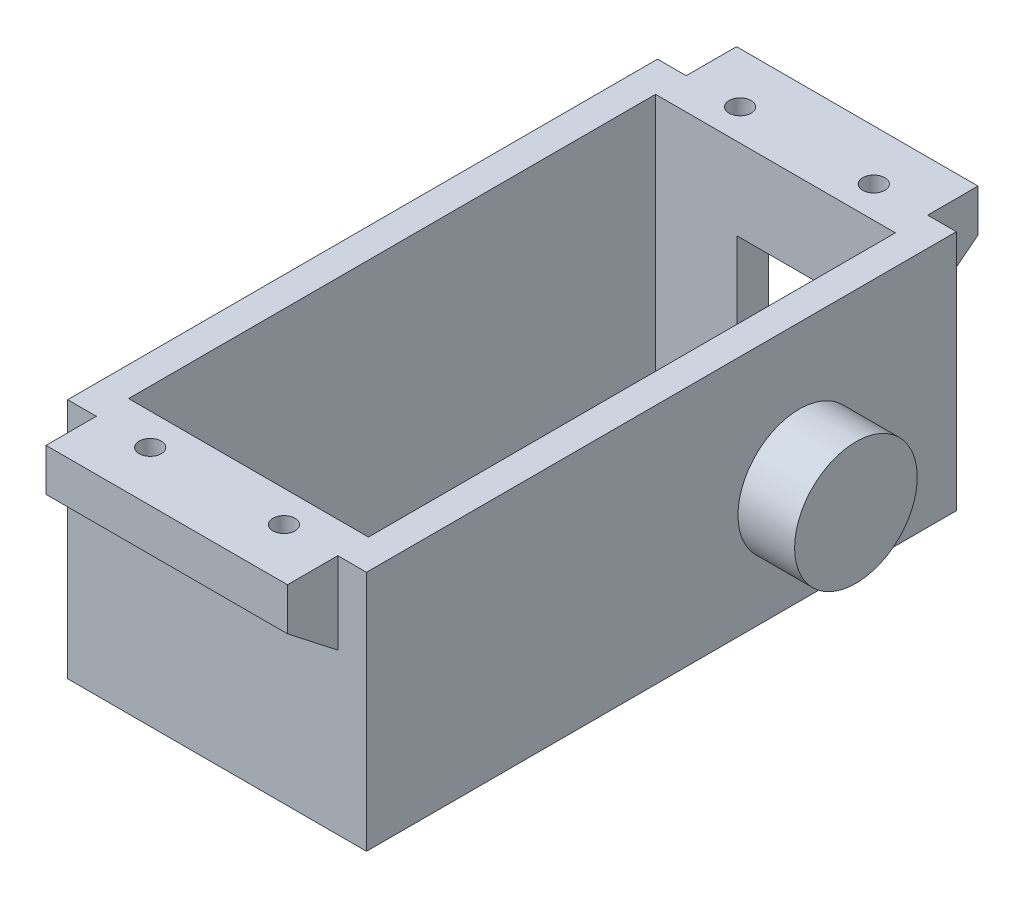
ISO-10303-21;
HEADER;
FILE_DESCRIPTION(('STEP AP214'),'2;1');
FILE_NAME('part.step','',(''),(''),'','','');
FILE_SCHEMA(('AUTOMOTIVE_DESIGN { 1 0 10303 214 1 1 1 1 }'));
ENDSEC;
DATA;
#1=APPLICATION_CONTEXT('core data for automotive mechanical design processes');
#2=APPLICATION_PROTOCOL_DEFINITION('international standard','automotive_design',2000,#1);
#3=PRODUCT_CONTEXT('',#1,'mechanical');
#4=PRODUCT('Part','Part','',(#3));
#5=PRODUCT_RELATED_PRODUCT_CATEGORY('part','',(#4));
#6=PRODUCT_DEFINITION_FORMATION('','',#4);
#7=PRODUCT_DEFINITION_CONTEXT('part definition',#1,'design');
#8=PRODUCT_DEFINITION('design','',#6,#7);
#9=PRODUCT_DEFINITION_SHAPE('','',#8);
#10=(LENGTH_UNIT() NAMED_UNIT(*) SI_UNIT(.MILLI.,.METRE.));
#11=(NAMED_UNIT(*) PLANE_ANGLE_UNIT() SI_UNIT($,.RADIAN.));
#12=(NAMED_UNIT(*) SI_UNIT($,.STERADIAN.) SOLID_ANGLE_UNIT());
#13=UNCERTAINTY_MEASURE_WITH_UNIT(LENGTH_MEASURE(1.E-05),#10,'distance_accuracy_value','');
#14=(GEOMETRIC_REPRESENTATION_CONTEXT(3) GLOBAL_UNCERTAINTY_ASSIGNED_CONTEXT((#13)) GLOBAL_UNIT_ASSIGNED_CONTEXT((#10,
#11,#12)) REPRESENTATION_CONTEXT('',''));
#15=CARTESIAN_POINT('',(0.,0.,0.));
#16=DIRECTION('',(0.,0.,1.));
#17=DIRECTION('',(1.,0.,0.));
#18=AXIS2_PLACEMENT_3D('',#15,#16,#17);
#19=CARTESIAN_POINT('',(15.35,20.33,43.9));
#20=DIRECTION('',(1.,0.,0.));
#21=DIRECTION('',(0.,0.,-1.));
#22=AXIS2_PLACEMENT_3D('',#19,#20,#21);
#23=PLANE('',#22);
#24=DIRECTION('',(0.,-1.,0.));
#25=VECTOR('',#24,1.);
#26=CARTESIAN_POINT('',(15.35,20.33,43.9));
#27=LINE('',#26,#25);
#28=CARTESIAN_POINT('',(15.35,30.73,43.9));
#29=VERTEX_POINT('',#28);
#30=CARTESIAN_POINT('',(15.35,25.330228009643,43.9));
#31=VERTEX_POINT('',#30);
#32=EDGE_CURVE('E194',#29,#31,#27,.T.);
#33=ORIENTED_EDGE('',*,*,#32,.T.);
#34=DIRECTION('',(0.,-0.615661475325662,-0.788010753606719));
#35=VECTOR('',#34,1.);
#36=CARTESIAN_POINT('',(15.35,20.33,37.5));
#37=LINE('',#36,#35);
#38=CARTESIAN_POINT('',(15.35,20.33,37.5));
#39=VERTEX_POINT('',#38);
#40=EDGE_CURVE('E56',#31,#39,#37,.T.);
#41=ORIENTED_EDGE('',*,*,#40,.T.);
#42=DIRECTION('',(0.,-1.,0.));
#43=VECTOR('',#42,1.);
#44=CARTESIAN_POINT('',(15.35,20.33,37.5));
#45=LINE('',#44,#43);
#46=CARTESIAN_POINT('',(15.35,30.73,37.5));
#47=VERTEX_POINT('',#46);
#48=EDGE_CURVE('E183',#47,#39,#45,.T.);
#49=ORIENTED_EDGE('',*,*,#48,.F.);
#50=DIRECTION('',(0.,0.,-1.));
#51=VECTOR('',#50,1.);
#52=CARTESIAN_POINT('',(15.35,30.73,43.9));
#53=LINE('',#52,#51);
#54=EDGE_CURVE('E202',#29,#47,#53,.T.);
#55=ORIENTED_EDGE('',*,*,#54,.F.);
#56=EDGE_LOOP('',(#33,#41,#49,#55));
#57=FACE_BOUND('',#56,.T.);
#58=ADVANCED_FACE('F41',(#57),#23,.T.);
#59=CARTESIAN_POINT('',(-15.35,20.33,43.9));
#60=DIRECTION('',(-1.,0.,0.));
#61=DIRECTION('',(0.,0.,1.));
#62=AXIS2_PLACEMENT_3D('',#59,#60,#61);
#63=PLANE('',#62);
#64=DIRECTION('',(0.,1.,0.));
#65=VECTOR('',#64,1.);
#66=CARTESIAN_POINT('',(-15.35,20.33,37.5));
#67=LINE('',#66,#65);
#68=CARTESIAN_POINT('',(-15.35,20.33,37.5));
#69=VERTEX_POINT('',#68);
#70=CARTESIAN_POINT('',(-15.35,30.73,37.5));
#71=VERTEX_POINT('',#70);
#72=EDGE_CURVE('E185',#69,#71,#67,.T.);
#73=ORIENTED_EDGE('',*,*,#72,.F.);
#74=DIRECTION('',(0.,-0.615661475325662,-0.788010753606719));
#75=VECTOR('',#74,1.);
#76=CARTESIAN_POINT('',(-15.35,20.33,37.5));
#77=LINE('',#76,#75);
#78=CARTESIAN_POINT('',(-15.35,25.330228009643,43.9));
#79=VERTEX_POINT('',#78);
#80=EDGE_CURVE('E177',#79,#69,#77,.T.);
#81=ORIENTED_EDGE('',*,*,#80,.F.);
#82=DIRECTION('',(0.,1.,0.));
#83=VECTOR('',#82,1.);
#84=CARTESIAN_POINT('',(-15.35,20.33,43.9));
#85=LINE('',#84,#83);
#86=CARTESIAN_POINT('',(-15.35,30.73,43.9));
#87=VERTEX_POINT('',#86);
#88=EDGE_CURVE('E203',#79,#87,#85,.T.);
#89=ORIENTED_EDGE('',*,*,#88,.T.);
#90=DIRECTION('',(0.,0.,-1.));
#91=VECTOR('',#90,1.);
#92=CARTESIAN_POINT('',(-15.35,30.73,43.9));
#93=LINE('',#92,#91);
#94=EDGE_CURVE('E64',#87,#71,#93,.T.);
#95=ORIENTED_EDGE('',*,*,#94,.T.);
#96=EDGE_LOOP('',(#73,#81,#89,#95));
#97=FACE_BOUND('',#96,.T.);
#98=ADVANCED_FACE('F186',(#97),#63,.T.);
#99=CARTESIAN_POINT('',(0.,0.,43.9));
#100=DIRECTION('',(0.,0.,1.));
#101=DIRECTION('',(-1.,0.,0.));
#102=AXIS2_PLACEMENT_3D('',#99,#100,#101);
#103=PLANE('',#102);
#104=ORIENTED_EDGE('',*,*,#88,.F.);
#105=DIRECTION('',(1.,0.,0.));
#106=VECTOR('',#105,1.);
#107=CARTESIAN_POINT('',(-26.201,25.330228009643,43.9));
#108=LINE('',#107,#106);
#109=EDGE_CURVE('E181',#79,#31,#108,.T.);
#110=ORIENTED_EDGE('',*,*,#109,.T.);
#111=ORIENTED_EDGE('',*,*,#32,.F.);
#112=DIRECTION('',(1.,0.,0.));
#113=VECTOR('',#112,1.);
#114=CARTESIAN_POINT('',(-15.35,30.73,43.9));
#115=LINE('',#114,#113);
#116=EDGE_CURVE('E197',#87,#29,#115,.T.);
#117=ORIENTED_EDGE('',*,*,#116,.F.);
#118=EDGE_LOOP('',(#104,#110,#111,#117));
#119=FACE_BOUND('',#118,.T.);
#120=ADVANCED_FACE('F379',(#119),#103,.T.);
#121=CARTESIAN_POINT('',(19.,30.73,-37.5));
#122=DIRECTION('',(0.,0.,1.));
#123=DIRECTION('',(1.,0.,0.));
#124=AXIS2_PLACEMENT_3D('',#121,#122,#123);
#125=PLANE('',#124);
#126=DIRECTION('',(-1.,0.,0.));
#127=VECTOR('',#126,1.);
#128=CARTESIAN_POINT('',(19.,0.,-37.5));
#129=LINE('',#128,#127);
#130=CARTESIAN_POINT('',(19.,0.,-37.5));
#131=VERTEX_POINT('',#130);
#132=CARTESIAN_POINT('',(4.9,0.,-37.5));
#133=VERTEX_POINT('',#132);
#134=EDGE_CURVE('E306',#131,#133,#129,.T.);
#135=ORIENTED_EDGE('',*,*,#134,.T.);
#136=DIRECTION('',(0.,-1.,0.));
#137=VECTOR('',#136,1.);
#138=CARTESIAN_POINT('',(4.9,0.,-37.5));
#139=LINE('',#138,#137);
#140=CARTESIAN_POINT('',(4.9,20.33,-37.5));
#141=VERTEX_POINT('',#140);
#142=EDGE_CURVE('E221',#141,#133,#139,.T.);
#143=ORIENTED_EDGE('',*,*,#142,.F.);
#144=DIRECTION('',(-1.,0.,0.));
#145=VECTOR('',#144,1.);
#146=CARTESIAN_POINT('',(-15.35,20.33,-37.5));
#147=LINE('',#146,#145);
#148=CARTESIAN_POINT('',(15.35,20.33,-37.5));
#149=VERTEX_POINT('',#148);
#150=EDGE_CURVE('E289',#149,#141,#147,.T.);
#151=ORIENTED_EDGE('',*,*,#150,.F.);
#152=DIRECTION('',(0.,-1.,0.));
#153=VECTOR('',#152,1.);
#154=CARTESIAN_POINT('',(15.35,20.33,-37.5));
#155=LINE('',#154,#153);
#156=CARTESIAN_POINT('',(15.35,30.73,-37.5));
#157=VERTEX_POINT('',#156);
#158=EDGE_CURVE('E270',#157,#149,#155,.T.);
#159=ORIENTED_EDGE('',*,*,#158,.F.);
#160=DIRECTION('',(-1.,0.,0.));
#161=VECTOR('',#160,1.);
#162=CARTESIAN_POINT('',(19.,30.73,-37.5));
#163=LINE('',#162,#161);
#164=CARTESIAN_POINT('',(19.,30.73,-37.5));
#165=VERTEX_POINT('',#164);
#166=EDGE_CURVE('E312',#165,#157,#163,.T.);
#167=ORIENTED_EDGE('',*,*,#166,.F.);
#168=DIRECTION('',(0.,-1.,0.));
#169=VECTOR('',#168,1.);
#170=CARTESIAN_POINT('',(19.,30.73,-37.5));
#171=LINE('',#170,#169);
#172=EDGE_CURVE('E327',#165,#131,#171,.T.);
#173=ORIENTED_EDGE('',*,*,#172,.T.);
#174=EDGE_LOOP('',(#135,#143,#151,#159,#167,#173));
#175=FACE_BOUND('',#174,.T.);
#176=ADVANCED_FACE('F351',(#175),#125,.F.);
#177=CARTESIAN_POINT('',(-4.9,20.33,-37.5));
#178=VERTEX_POINT('',#177);
#179=CARTESIAN_POINT('',(-15.35,20.33,-37.5));
#180=VERTEX_POINT('',#179);
#181=EDGE_CURVE('E288',#178,#180,#147,.T.);
#182=ORIENTED_EDGE('',*,*,#181,.F.);
#183=DIRECTION('',(0.,1.,0.));
#184=VECTOR('',#183,1.);
#185=CARTESIAN_POINT('',(-4.9,0.,-37.5));
#186=LINE('',#185,#184);
#187=CARTESIAN_POINT('',(-4.9,0.,-37.5));
#188=VERTEX_POINT('',#187);
#189=EDGE_CURVE('E223',#188,#178,#186,.T.);
#190=ORIENTED_EDGE('',*,*,#189,.F.);
#191=CARTESIAN_POINT('',(-19.,0.,-37.5));
#192=VERTEX_POINT('',#191);
#193=EDGE_CURVE('E322',#188,#192,#129,.T.);
#194=ORIENTED_EDGE('',*,*,#193,.T.);
#195=DIRECTION('',(0.,-1.,0.));
#196=VECTOR('',#195,1.);
#197=CARTESIAN_POINT('',(-19.,30.73,-37.5));
#198=LINE('',#197,#196);
#199=CARTESIAN_POINT('',(-19.,30.73,-37.5));
#200=VERTEX_POINT('',#199);
#201=EDGE_CURVE('E315',#200,#192,#198,.T.);
#202=ORIENTED_EDGE('',*,*,#201,.F.);
#203=CARTESIAN_POINT('',(-15.35,30.73,-37.5));
#204=VERTEX_POINT('',#203);
#205=EDGE_CURVE('E311',#204,#200,#163,.T.);
#206=ORIENTED_EDGE('',*,*,#205,.F.);
#207=DIRECTION('',(0.,1.,0.));
#208=VECTOR('',#207,1.);
#209=CARTESIAN_POINT('',(-15.35,20.33,-37.5));
#210=LINE('',#209,#208);
#211=EDGE_CURVE('E281',#180,#204,#210,.T.);
#212=ORIENTED_EDGE('',*,*,#211,.F.);
#213=EDGE_LOOP('',(#182,#190,#194,#202,#206,#212));
#214=FACE_BOUND('',#213,.T.);
#215=ADVANCED_FACE('F373',(#214),#125,.F.);
#216=CARTESIAN_POINT('',(-19.,30.73,37.5));
#217=DIRECTION('',(1.,0.,0.));
#218=DIRECTION('',(0.,0.,-1.));
#219=AXIS2_PLACEMENT_3D('',#216,#217,#218);
#220=PLANE('',#219);
#221=CARTESIAN_POINT('',(-19.,13.39,-17.53));
#222=DIRECTION('',(1.,0.,0.));
#223=DIRECTION('',(0.,0.,-1.));
#224=AXIS2_PLACEMENT_3D('',#221,#222,#223);
#225=CIRCLE('',#224,7.8);
#226=CARTESIAN_POINT('',(-19.,13.39,-25.33));
#227=VERTEX_POINT('',#226);
#228=EDGE_CURVE('E11',#227,#227,#225,.F.);
#229=ORIENTED_EDGE('',*,*,#228,.F.);
#230=EDGE_LOOP('',(#229));
#231=FACE_BOUND('',#230,.T.);
#232=DIRECTION('',(0.,0.,1.));
#233=VECTOR('',#232,1.);
#234=CARTESIAN_POINT('',(-19.,0.,37.5));
#235=LINE('',#234,#233);
#236=CARTESIAN_POINT('',(-19.,0.,37.5));
#237=VERTEX_POINT('',#236);
#238=EDGE_CURVE('E301',#192,#237,#235,.T.);
#239=ORIENTED_EDGE('',*,*,#238,.T.);
#240=DIRECTION('',(0.,-1.,0.));
#241=VECTOR('',#240,1.);
#242=CARTESIAN_POINT('',(-19.,30.73,37.5));
#243=LINE('',#242,#241);
#244=CARTESIAN_POINT('',(-19.,30.73,37.5));
#245=VERTEX_POINT('',#244);
#246=EDGE_CURVE('E49',#245,#237,#243,.T.);
#247=ORIENTED_EDGE('',*,*,#246,.F.);
#248=DIRECTION('',(0.,0.,1.));
#249=VECTOR('',#248,1.);
#250=CARTESIAN_POINT('',(-19.,30.73,37.5));
#251=LINE('',#250,#249);
#252=EDGE_CURVE('E302',#200,#245,#251,.T.);
#253=ORIENTED_EDGE('',*,*,#252,.F.);
#254=ORIENTED_EDGE('',*,*,#201,.T.);
#255=EDGE_LOOP('',(#239,#247,#253,#254));
#256=FACE_BOUND('',#255,.T.);
#257=ADVANCED_FACE('F43',(#231,#256),#220,.F.);
#258=CARTESIAN_POINT('',(19.,30.73,37.5));
#259=DIRECTION('',(0.,0.,-1.));
#260=DIRECTION('',(-1.,0.,0.));
#261=AXIS2_PLACEMENT_3D('',#258,#259,#260);
#262=PLANE('',#261);
#263=DIRECTION('',(1.,0.,0.));
#264=VECTOR('',#263,1.);
#265=CARTESIAN_POINT('',(19.,30.73,37.5));
#266=LINE('',#265,#264);
#267=CARTESIAN_POINT('',(19.,30.73,37.5));
#268=VERTEX_POINT('',#267);
#269=EDGE_CURVE('E305',#47,#268,#266,.T.);
#270=ORIENTED_EDGE('',*,*,#269,.F.);
#271=ORIENTED_EDGE('',*,*,#48,.T.);
#272=DIRECTION('',(-1.,0.,0.));
#273=VECTOR('',#272,1.);
#274=CARTESIAN_POINT('',(-15.35,20.33,37.5));
#275=LINE('',#274,#273);
#276=EDGE_CURVE('E180',#39,#69,#275,.T.);
#277=ORIENTED_EDGE('',*,*,#276,.T.);
#278=ORIENTED_EDGE('',*,*,#72,.T.);
#279=EDGE_CURVE('E307',#245,#71,#266,.T.);
#280=ORIENTED_EDGE('',*,*,#279,.F.);
#281=ORIENTED_EDGE('',*,*,#246,.T.);
#282=DIRECTION('',(1.,0.,0.));
#283=VECTOR('',#282,1.);
#284=CARTESIAN_POINT('',(19.,0.,37.5));
#285=LINE('',#284,#283);
#286=CARTESIAN_POINT('',(19.,0.,37.5));
#287=VERTEX_POINT('',#286);
#288=EDGE_CURVE('E318',#237,#287,#285,.T.);
#289=ORIENTED_EDGE('',*,*,#288,.T.);
#290=DIRECTION('',(0.,-1.,0.));
#291=VECTOR('',#290,1.);
#292=CARTESIAN_POINT('',(19.,30.73,37.5));
#293=LINE('',#292,#291);
#294=EDGE_CURVE('E330',#268,#287,#293,.T.);
#295=ORIENTED_EDGE('',*,*,#294,.F.);
#296=EDGE_LOOP('',(#270,#271,#277,#278,#280,#281,#289,#295));
#297=FACE_BOUND('',#296,.T.);
#298=ADVANCED_FACE('F192',(#297),#262,.F.);
#299=CARTESIAN_POINT('',(19.,30.73,37.5));
#300=DIRECTION('',(-1.,0.,0.));
#301=DIRECTION('',(0.,0.,1.));
#302=AXIS2_PLACEMENT_3D('',#299,#300,#301);
#303=PLANE('',#302);
#304=CARTESIAN_POINT('',(19.,13.39,-17.53));
#305=DIRECTION('',(-1.,0.,0.));
#306=DIRECTION('',(0.,0.,1.));
#307=AXIS2_PLACEMENT_3D('',#304,#305,#306);
#308=CIRCLE('',#307,7.8);
#309=CARTESIAN_POINT('',(19.,13.39,-9.73000000000001));
#310=VERTEX_POINT('',#309);
#311=EDGE_CURVE('E230',#310,#310,#308,.T.);
#312=ORIENTED_EDGE('',*,*,#311,.T.);
#313=EDGE_LOOP('',(#312));
#314=FACE_BOUND('',#313,.T.);
#315=DIRECTION('',(0.,0.,-1.));
#316=VECTOR('',#315,1.);
#317=CARTESIAN_POINT('',(19.,0.,37.5));
#318=LINE('',#317,#316);
#319=EDGE_CURVE('E320',#287,#131,#318,.T.);
#320=ORIENTED_EDGE('',*,*,#319,.T.);
#321=ORIENTED_EDGE('',*,*,#172,.F.);
#322=DIRECTION('',(0.,0.,-1.));
#323=VECTOR('',#322,1.);
#324=CARTESIAN_POINT('',(19.,30.73,37.5));
#325=LINE('',#324,#323);
#326=EDGE_CURVE('E309',#268,#165,#325,.T.);
#327=ORIENTED_EDGE('',*,*,#326,.F.);
#328=ORIENTED_EDGE('',*,*,#294,.T.);
#329=EDGE_LOOP('',(#320,#321,#327,#328));
#330=FACE_BOUND('',#329,.T.);
#331=ADVANCED_FACE('F347',(#314,#330),#303,.F.);
#332=CARTESIAN_POINT('',(0.,30.73,0.));
#333=DIRECTION('',(0.,1.,0.));
#334=DIRECTION('',(0.,0.,1.));
#335=AXIS2_PLACEMENT_3D('',#332,#333,#334);
#336=PLANE('',#335);
#337=CARTESIAN_POINT('',(-8.49999999999999,30.73,37.5));
#338=DIRECTION('',(0.,1.,0.));
#339=DIRECTION('',(0.,0.,-1.));
#340=AXIS2_PLACEMENT_3D('',#337,#338,#339);
#341=CIRCLE('',#340,1.4);
#342=CARTESIAN_POINT('',(-8.49999999999999,30.73,36.1));
#343=VERTEX_POINT('',#342);
#344=EDGE_CURVE('E395',#343,#343,#341,.T.);
#345=ORIENTED_EDGE('',*,*,#344,.F.);
#346=EDGE_LOOP('',(#345));
#347=FACE_BOUND('',#346,.T.);
#348=CARTESIAN_POINT('',(8.5,30.73,37.5));
#349=DIRECTION('',(0.,1.,0.));
#350=DIRECTION('',(0.,0.,1.));
#351=AXIS2_PLACEMENT_3D('',#348,#349,#350);
#352=CIRCLE('',#351,1.4);
#353=CARTESIAN_POINT('',(8.5,30.73,38.9));
#354=VERTEX_POINT('',#353);
#355=EDGE_CURVE('E401',#354,#354,#352,.T.);
#356=ORIENTED_EDGE('',*,*,#355,.F.);
#357=EDGE_LOOP('',(#356));
#358=FACE_BOUND('',#357,.T.);
#359=CARTESIAN_POINT('',(8.5,30.73,-37.5));
#360=DIRECTION('',(0.,1.,0.));
#361=DIRECTION('',(0.,0.,-1.));
#362=AXIS2_PLACEMENT_3D('',#359,#360,#361);
#363=CIRCLE('',#362,1.4);
#364=CARTESIAN_POINT('',(8.5,30.73,-38.9));
#365=VERTEX_POINT('',#364);
#366=EDGE_CURVE('E389',#365,#365,#363,.T.);
#367=ORIENTED_EDGE('',*,*,#366,.F.);
#368=EDGE_LOOP('',(#367));
#369=FACE_BOUND('',#368,.T.);
#370=CARTESIAN_POINT('',(-8.5,30.73,-37.5));
#371=DIRECTION('',(0.,1.,0.));
#372=DIRECTION('',(0.,0.,1.));
#373=AXIS2_PLACEMENT_3D('',#370,#371,#372);
#374=CIRCLE('',#373,1.4);
#375=CARTESIAN_POINT('',(-8.5,30.73,-36.1));
#376=VERTEX_POINT('',#375);
#377=EDGE_CURVE('E386',#376,#376,#374,.T.);
#378=ORIENTED_EDGE('',*,*,#377,.F.);
#379=EDGE_LOOP('',(#378));
#380=FACE_BOUND('',#379,.T.);
#381=DIRECTION('',(0.,0.,1.));
#382=VECTOR('',#381,1.);
#383=CARTESIAN_POINT('',(-15.25,30.73,33.5));
#384=LINE('',#383,#382);
#385=CARTESIAN_POINT('',(-15.25,30.73,-33.5));
#386=VERTEX_POINT('',#385);
#387=CARTESIAN_POINT('',(-15.25,30.73,33.5));
#388=VERTEX_POINT('',#387);
#389=EDGE_CURVE('E241',#386,#388,#384,.T.);
#390=ORIENTED_EDGE('',*,*,#389,.F.);
#391=DIRECTION('',(-1.,0.,0.));
#392=VECTOR('',#391,1.);
#393=CARTESIAN_POINT('',(15.25,30.73,-33.5));
#394=LINE('',#393,#392);
#395=CARTESIAN_POINT('',(15.25,30.73,-33.5));
#396=VERTEX_POINT('',#395);
#397=EDGE_CURVE('E248',#396,#386,#394,.T.);
#398=ORIENTED_EDGE('',*,*,#397,.F.);
#399=DIRECTION('',(0.,0.,-1.));
#400=VECTOR('',#399,1.);
#401=CARTESIAN_POINT('',(15.25,30.73,33.5));
#402=LINE('',#401,#400);
#403=CARTESIAN_POINT('',(15.25,30.73,33.5));
#404=VERTEX_POINT('',#403);
#405=EDGE_CURVE('E263',#404,#396,#402,.T.);
#406=ORIENTED_EDGE('',*,*,#405,.F.);
#407=DIRECTION('',(1.,0.,0.));
#408=VECTOR('',#407,1.);
#409=CARTESIAN_POINT('',(15.25,30.73,33.5));
#410=LINE('',#409,#408);
#411=EDGE_CURVE('E260',#388,#404,#410,.T.);
#412=ORIENTED_EDGE('',*,*,#411,.F.);
#413=EDGE_LOOP('',(#390,#398,#406,#412));
#414=FACE_BOUND('',#413,.T.);
#415=ORIENTED_EDGE('',*,*,#252,.T.);
#416=ORIENTED_EDGE('',*,*,#279,.T.);
#417=ORIENTED_EDGE('',*,*,#94,.F.);
#418=ORIENTED_EDGE('',*,*,#116,.T.);
#419=ORIENTED_EDGE('',*,*,#54,.T.);
#420=ORIENTED_EDGE('',*,*,#269,.T.);
#421=ORIENTED_EDGE('',*,*,#326,.T.);
#422=ORIENTED_EDGE('',*,*,#166,.T.);
#423=DIRECTION('',(0.,0.,1.));
#424=VECTOR('',#423,1.);
#425=CARTESIAN_POINT('',(15.35,30.73,-43.9));
#426=LINE('',#425,#424);
#427=CARTESIAN_POINT('',(15.35,30.73,-43.9));
#428=VERTEX_POINT('',#427);
#429=EDGE_CURVE('E285',#428,#157,#426,.T.);
#430=ORIENTED_EDGE('',*,*,#429,.F.);
#431=DIRECTION('',(1.,0.,0.));
#432=VECTOR('',#431,1.);
#433=CARTESIAN_POINT('',(-15.35,30.73,-43.9));
#434=LINE('',#433,#432);
#435=CARTESIAN_POINT('',(-15.35,30.73,-43.9));
#436=VERTEX_POINT('',#435);
#437=EDGE_CURVE('E283',#436,#428,#434,.T.);
#438=ORIENTED_EDGE('',*,*,#437,.F.);
#439=DIRECTION('',(0.,0.,1.));
#440=VECTOR('',#439,1.);
#441=CARTESIAN_POINT('',(-15.35,30.73,-43.9));
#442=LINE('',#441,#440);
#443=EDGE_CURVE('E295',#436,#204,#442,.T.);
#444=ORIENTED_EDGE('',*,*,#443,.T.);
#445=ORIENTED_EDGE('',*,*,#205,.T.);
#446=EDGE_LOOP('',(#415,#416,#417,#418,#419,#420,#421,#422,#430,#438,#444,#445));
#447=FACE_BOUND('',#446,.T.);
#448=ADVANCED_FACE('F356',(#347,#358,#369,#380,#414,#447),#336,.T.);
#449=CARTESIAN_POINT('',(0.,0.,0.));
#450=DIRECTION('',(0.,1.,0.));
#451=DIRECTION('',(0.,0.,1.));
#452=AXIS2_PLACEMENT_3D('',#449,#450,#451);
#453=PLANE('',#452);
#454=DIRECTION('',(-1.,0.,0.));
#455=VECTOR('',#454,1.);
#456=CARTESIAN_POINT('',(15.25,0.,-33.5));
#457=LINE('',#456,#455);
#458=CARTESIAN_POINT('',(15.25,0.,-33.5));
#459=VERTEX_POINT('',#458);
#460=CARTESIAN_POINT('',(4.9,0.,-33.5));
#461=VERTEX_POINT('',#460);
#462=EDGE_CURVE('E255',#459,#461,#457,.T.);
#463=ORIENTED_EDGE('',*,*,#462,.T.);
#464=DIRECTION('',(0.,0.,-1.));
#465=VECTOR('',#464,1.);
#466=CARTESIAN_POINT('',(4.9,0.,37.501));
#467=LINE('',#466,#465);
#468=EDGE_CURVE('E226',#461,#133,#467,.T.);
#469=ORIENTED_EDGE('',*,*,#468,.T.);
#470=ORIENTED_EDGE('',*,*,#134,.F.);
#471=ORIENTED_EDGE('',*,*,#319,.F.);
#472=ORIENTED_EDGE('',*,*,#288,.F.);
#473=ORIENTED_EDGE('',*,*,#238,.F.);
#474=ORIENTED_EDGE('',*,*,#193,.F.);
#475=DIRECTION('',(0.,0.,-1.));
#476=VECTOR('',#475,1.);
#477=CARTESIAN_POINT('',(-4.9,0.,37.501));
#478=LINE('',#477,#476);
#479=CARTESIAN_POINT('',(-4.9,0.,-33.5));
#480=VERTEX_POINT('',#479);
#481=EDGE_CURVE('E234',#480,#188,#478,.T.);
#482=ORIENTED_EDGE('',*,*,#481,.F.);
#483=CARTESIAN_POINT('',(-15.25,0.,-33.5));
#484=VERTEX_POINT('',#483);
#485=EDGE_CURVE('E254',#480,#484,#457,.T.);
#486=ORIENTED_EDGE('',*,*,#485,.T.);
#487=DIRECTION('',(0.,0.,1.));
#488=VECTOR('',#487,1.);
#489=CARTESIAN_POINT('',(-15.25,0.,33.5));
#490=LINE('',#489,#488);
#491=CARTESIAN_POINT('',(-15.25,0.,33.5));
#492=VERTEX_POINT('',#491);
#493=EDGE_CURVE('E244',#484,#492,#490,.T.);
#494=ORIENTED_EDGE('',*,*,#493,.T.);
#495=DIRECTION('',(1.,0.,0.));
#496=VECTOR('',#495,1.);
#497=CARTESIAN_POINT('',(15.25,0.,33.5));
#498=LINE('',#497,#496);
#499=CARTESIAN_POINT('',(15.25,0.,33.5));
#500=VERTEX_POINT('',#499);
#501=EDGE_CURVE('E247',#492,#500,#498,.T.);
#502=ORIENTED_EDGE('',*,*,#501,.T.);
#503=DIRECTION('',(0.,0.,-1.));
#504=VECTOR('',#503,1.);
#505=CARTESIAN_POINT('',(15.25,0.,33.5));
#506=LINE('',#505,#504);
#507=EDGE_CURVE('E251',#500,#459,#506,.T.);
#508=ORIENTED_EDGE('',*,*,#507,.T.);
#509=EDGE_LOOP('',(#463,#469,#470,#471,#472,#473,#474,#482,#486,#494,#502,#508));
#510=FACE_BOUND('',#509,.T.);
#511=ADVANCED_FACE('F341',(#510),#453,.F.);
#512=CARTESIAN_POINT('',(-26.2,13.39,-17.53));
#513=DIRECTION('',(1.,0.,0.));
#514=DIRECTION('',(0.,0.,-1.));
#515=AXIS2_PLACEMENT_3D('',#512,#513,#514);
#516=CYLINDRICAL_SURFACE('',#515,7.8);
#517=CARTESIAN_POINT('',(-26.2,13.39,-17.53));
#518=DIRECTION('',(-1.,0.,0.));
#519=DIRECTION('',(0.,0.,1.));
#520=AXIS2_PLACEMENT_3D('',#517,#518,#519);
#521=CIRCLE('',#520,7.8);
#522=CARTESIAN_POINT('',(-26.2,13.39,-9.73000000000001));
#523=VERTEX_POINT('',#522);
#524=EDGE_CURVE('E298',#523,#523,#521,.T.);
#525=ORIENTED_EDGE('',*,*,#524,.F.);
#526=EDGE_LOOP('',(#525));
#527=FACE_BOUND('',#526,.T.);
#528=ORIENTED_EDGE('',*,*,#228,.T.);
#529=EDGE_LOOP('',(#528));
#530=FACE_BOUND('',#529,.T.);
#531=ADVANCED_FACE('F679',(#527,#530),#516,.T.);
#532=CARTESIAN_POINT('',(-26.2,13.39,-17.53));
#533=DIRECTION('',(-1.,0.,0.));
#534=DIRECTION('',(0.,0.,1.));
#535=AXIS2_PLACEMENT_3D('',#532,#533,#534);
#536=PLANE('',#535);
#537=ORIENTED_EDGE('',*,*,#524,.T.);
#538=EDGE_LOOP('',(#537));
#539=FACE_BOUND('',#538,.T.);
#540=ADVANCED_FACE('F663',(#539),#536,.T.);
#541=CARTESIAN_POINT('',(15.35,20.33,-43.9));
#542=DIRECTION('',(-1.,0.,0.));
#543=DIRECTION('',(0.,0.,1.));
#544=AXIS2_PLACEMENT_3D('',#541,#542,#543);
#545=PLANE('',#544);
#546=ORIENTED_EDGE('',*,*,#158,.T.);
#547=DIRECTION('',(0.,-0.615661475325662,0.788010753606719));
#548=VECTOR('',#547,1.);
#549=CARTESIAN_POINT('',(15.35,20.33,-37.5));
#550=LINE('',#549,#548);
#551=CARTESIAN_POINT('',(15.35,25.330228009643,-43.9));
#552=VERTEX_POINT('',#551);
#553=EDGE_CURVE('E207',#552,#149,#550,.T.);
#554=ORIENTED_EDGE('',*,*,#553,.F.);
#555=DIRECTION('',(0.,-1.,0.));
#556=VECTOR('',#555,1.);
#557=CARTESIAN_POINT('',(15.35,20.33,-43.9));
#558=LINE('',#557,#556);
#559=EDGE_CURVE('E277',#428,#552,#558,.T.);
#560=ORIENTED_EDGE('',*,*,#559,.F.);
#561=ORIENTED_EDGE('',*,*,#429,.T.);
#562=EDGE_LOOP('',(#546,#554,#560,#561));
#563=FACE_BOUND('',#562,.T.);
#564=ADVANCED_FACE('F360',(#563),#545,.F.);
#565=CARTESIAN_POINT('',(-15.35,20.33,-43.9));
#566=DIRECTION('',(0.,1.,0.));
#567=DIRECTION('',(-1.,0.,0.));
#568=AXIS2_PLACEMENT_3D('',#565,#566,#567);
#569=PLANE('',#568);
#570=DIRECTION('',(0.,0.,-1.));
#571=VECTOR('',#570,1.);
#572=CARTESIAN_POINT('',(-4.9,20.33,37.501));
#573=LINE('',#572,#571);
#574=CARTESIAN_POINT('',(-4.9,20.33,-33.5));
#575=VERTEX_POINT('',#574);
#576=EDGE_CURVE('E231',#575,#178,#573,.T.);
#577=ORIENTED_EDGE('',*,*,#576,.T.);
#578=DIRECTION('',(1.,0.,0.));
#579=VECTOR('',#578,1.);
#580=CARTESIAN_POINT('',(-26.201,20.33,-37.5));
#581=LINE('',#580,#579);
#582=EDGE_CURVE('E210',#178,#141,#581,.T.);
#583=ORIENTED_EDGE('',*,*,#582,.T.);
#584=DIRECTION('',(0.,0.,-1.));
#585=VECTOR('',#584,1.);
#586=CARTESIAN_POINT('',(4.9,20.33,37.501));
#587=LINE('',#586,#585);
#588=CARTESIAN_POINT('',(4.9,20.33,-33.5));
#589=VERTEX_POINT('',#588);
#590=EDGE_CURVE('E227',#589,#141,#587,.T.);
#591=ORIENTED_EDGE('',*,*,#590,.F.);
#592=DIRECTION('',(-1.,0.,0.));
#593=VECTOR('',#592,1.);
#594=CARTESIAN_POINT('',(-4.9,20.33,-33.5));
#595=LINE('',#594,#593);
#596=EDGE_CURVE('E216',#589,#575,#595,.T.);
#597=ORIENTED_EDGE('',*,*,#596,.T.);
#598=EDGE_LOOP('',(#577,#583,#591,#597));
#599=FACE_BOUND('',#598,.T.);
#600=ADVANCED_FACE('F443',(#599),#569,.F.);
#601=CARTESIAN_POINT('',(-15.35,20.33,-43.9));
#602=DIRECTION('',(1.,0.,0.));
#603=DIRECTION('',(0.,0.,-1.));
#604=AXIS2_PLACEMENT_3D('',#601,#602,#603);
#605=PLANE('',#604);
#606=DIRECTION('',(0.,1.,0.));
#607=VECTOR('',#606,1.);
#608=CARTESIAN_POINT('',(-15.35,20.33,-43.9));
#609=LINE('',#608,#607);
#610=CARTESIAN_POINT('',(-15.35,25.330228009643,-43.9));
#611=VERTEX_POINT('',#610);
#612=EDGE_CURVE('E280',#611,#436,#609,.T.);
#613=ORIENTED_EDGE('',*,*,#612,.F.);
#614=DIRECTION('',(0.,0.615661475325662,-0.788010753606719));
#615=VECTOR('',#614,1.);
#616=CARTESIAN_POINT('',(-15.35,20.33,-37.5));
#617=LINE('',#616,#615);
#618=EDGE_CURVE('E205',#180,#611,#617,.T.);
#619=ORIENTED_EDGE('',*,*,#618,.F.);
#620=ORIENTED_EDGE('',*,*,#211,.T.);
#621=ORIENTED_EDGE('',*,*,#443,.F.);
#622=EDGE_LOOP('',(#613,#619,#620,#621));
#623=FACE_BOUND('',#622,.T.);
#624=ADVANCED_FACE('F368',(#623),#605,.F.);
#625=CARTESIAN_POINT('',(0.,0.,-43.9));
#626=DIRECTION('',(0.,0.,-1.));
#627=DIRECTION('',(-1.,0.,0.));
#628=AXIS2_PLACEMENT_3D('',#625,#626,#627);
#629=PLANE('',#628);
#630=DIRECTION('',(1.,0.,0.));
#631=VECTOR('',#630,1.);
#632=CARTESIAN_POINT('',(-26.201,25.330228009643,-43.9));
#633=LINE('',#632,#631);
#634=EDGE_CURVE('E209',#611,#552,#633,.T.);
#635=ORIENTED_EDGE('',*,*,#634,.F.);
#636=ORIENTED_EDGE('',*,*,#612,.T.);
#637=ORIENTED_EDGE('',*,*,#437,.T.);
#638=ORIENTED_EDGE('',*,*,#559,.T.);
#639=EDGE_LOOP('',(#635,#636,#637,#638));
#640=FACE_BOUND('',#639,.T.);
#641=ADVANCED_FACE('F364',(#640),#629,.T.);
#642=CARTESIAN_POINT('',(-15.25,0.,33.5));
#643=DIRECTION('',(-1.,0.,0.));
#644=DIRECTION('',(0.,0.,1.));
#645=AXIS2_PLACEMENT_3D('',#642,#643,#644);
#646=PLANE('',#645);
#647=ORIENTED_EDGE('',*,*,#389,.T.);
#648=DIRECTION('',(0.,1.,0.));
#649=VECTOR('',#648,1.);
#650=CARTESIAN_POINT('',(-15.25,0.,33.5));
#651=LINE('',#650,#649);
#652=EDGE_CURVE('E258',#492,#388,#651,.T.);
#653=ORIENTED_EDGE('',*,*,#652,.F.);
#654=ORIENTED_EDGE('',*,*,#493,.F.);
#655=DIRECTION('',(0.,1.,0.));
#656=VECTOR('',#655,1.);
#657=CARTESIAN_POINT('',(-15.25,0.,-33.5));
#658=LINE('',#657,#656);
#659=EDGE_CURVE('E268',#484,#386,#658,.T.);
#660=ORIENTED_EDGE('',*,*,#659,.T.);
#661=EDGE_LOOP('',(#647,#653,#654,#660));
#662=FACE_BOUND('',#661,.T.);
#663=ADVANCED_FACE('F423',(#662),#646,.F.);
#664=CARTESIAN_POINT('',(15.25,0.,-33.5));
#665=DIRECTION('',(0.,0.,-1.));
#666=DIRECTION('',(-1.,0.,0.));
#667=AXIS2_PLACEMENT_3D('',#664,#665,#666);
#668=PLANE('',#667);
#669=ORIENTED_EDGE('',*,*,#596,.F.);
#670=DIRECTION('',(0.,1.,0.));
#671=VECTOR('',#670,1.);
#672=CARTESIAN_POINT('',(4.9,0.,-33.5));
#673=LINE('',#672,#671);
#674=EDGE_CURVE('E218',#461,#589,#673,.T.);
#675=ORIENTED_EDGE('',*,*,#674,.F.);
#676=ORIENTED_EDGE('',*,*,#462,.F.);
#677=DIRECTION('',(0.,1.,0.));
#678=VECTOR('',#677,1.);
#679=CARTESIAN_POINT('',(15.25,0.,-33.5));
#680=LINE('',#679,#678);
#681=EDGE_CURVE('E271',#459,#396,#680,.T.);
#682=ORIENTED_EDGE('',*,*,#681,.T.);
#683=ORIENTED_EDGE('',*,*,#397,.T.);
#684=ORIENTED_EDGE('',*,*,#659,.F.);
#685=ORIENTED_EDGE('',*,*,#485,.F.);
#686=DIRECTION('',(0.,-1.,0.));
#687=VECTOR('',#686,1.);
#688=CARTESIAN_POINT('',(-4.9,0.,-33.5));
#689=LINE('',#688,#687);
#690=EDGE_CURVE('E213',#575,#480,#689,.T.);
#691=ORIENTED_EDGE('',*,*,#690,.F.);
#692=EDGE_LOOP('',(#669,#675,#676,#682,#683,#684,#685,#691));
#693=FACE_BOUND('',#692,.T.);
#694=ADVANCED_FACE('F434',(#693),#668,.F.);
#695=CARTESIAN_POINT('',(15.25,0.,33.5));
#696=DIRECTION('',(1.,0.,0.));
#697=DIRECTION('',(0.,0.,-1.));
#698=AXIS2_PLACEMENT_3D('',#695,#696,#697);
#699=PLANE('',#698);
#700=ORIENTED_EDGE('',*,*,#405,.T.);
#701=ORIENTED_EDGE('',*,*,#681,.F.);
#702=ORIENTED_EDGE('',*,*,#507,.F.);
#703=DIRECTION('',(0.,1.,0.));
#704=VECTOR('',#703,1.);
#705=CARTESIAN_POINT('',(15.25,0.,33.5));
#706=LINE('',#705,#704);
#707=EDGE_CURVE('E273',#500,#404,#706,.T.);
#708=ORIENTED_EDGE('',*,*,#707,.T.);
#709=EDGE_LOOP('',(#700,#701,#702,#708));
#710=FACE_BOUND('',#709,.T.);
#711=ADVANCED_FACE('F438',(#710),#699,.F.);
#712=CARTESIAN_POINT('',(15.25,0.,33.5));
#713=DIRECTION('',(0.,0.,1.));
#714=DIRECTION('',(1.,0.,0.));
#715=AXIS2_PLACEMENT_3D('',#712,#713,#714);
#716=PLANE('',#715);
#717=ORIENTED_EDGE('',*,*,#411,.T.);
#718=ORIENTED_EDGE('',*,*,#707,.F.);
#719=ORIENTED_EDGE('',*,*,#501,.F.);
#720=ORIENTED_EDGE('',*,*,#652,.T.);
#721=EDGE_LOOP('',(#717,#718,#719,#720));
#722=FACE_BOUND('',#721,.T.);
#723=ADVANCED_FACE('F428',(#722),#716,.F.);
#724=CARTESIAN_POINT('',(26.2,13.39,-17.53));
#725=DIRECTION('',(-1.,0.,0.));
#726=DIRECTION('',(0.,0.,1.));
#727=AXIS2_PLACEMENT_3D('',#724,#725,#726);
#728=CYLINDRICAL_SURFACE('',#727,7.8);
#729=CARTESIAN_POINT('',(26.2,13.39,-17.53));
#730=DIRECTION('',(-1.,0.,0.));
#731=DIRECTION('',(0.,0.,1.));
#732=AXIS2_PLACEMENT_3D('',#729,#730,#731);
#733=CIRCLE('',#732,7.8);
#734=CARTESIAN_POINT('',(26.2,13.39,-9.73000000000001));
#735=VERTEX_POINT('',#734);
#736=EDGE_CURVE('E238',#735,#735,#733,.T.);
#737=ORIENTED_EDGE('',*,*,#736,.T.);
#738=EDGE_LOOP('',(#737));
#739=FACE_BOUND('',#738,.T.);
#740=ORIENTED_EDGE('',*,*,#311,.F.);
#741=EDGE_LOOP('',(#740));
#742=FACE_BOUND('',#741,.T.);
#743=ADVANCED_FACE('F597',(#739,#742),#728,.T.);
#744=CARTESIAN_POINT('',(26.2,13.39,-17.53));
#745=DIRECTION('',(1.,0.,0.));
#746=DIRECTION('',(0.,0.,1.));
#747=AXIS2_PLACEMENT_3D('',#744,#745,#746);
#748=PLANE('',#747);
#749=ORIENTED_EDGE('',*,*,#736,.F.);
#750=EDGE_LOOP('',(#749));
#751=FACE_BOUND('',#750,.T.);
#752=ADVANCED_FACE('F455',(#751),#748,.T.);
#753=CARTESIAN_POINT('',(4.9,0.,37.501));
#754=DIRECTION('',(1.,0.,0.));
#755=DIRECTION('',(0.,1.,0.));
#756=AXIS2_PLACEMENT_3D('',#753,#754,#755);
#757=PLANE('',#756);
#758=ORIENTED_EDGE('',*,*,#674,.T.);
#759=ORIENTED_EDGE('',*,*,#590,.T.);
#760=ORIENTED_EDGE('',*,*,#142,.T.);
#761=ORIENTED_EDGE('',*,*,#468,.F.);
#762=EDGE_LOOP('',(#758,#759,#760,#761));
#763=FACE_BOUND('',#762,.T.);
#764=ADVANCED_FACE('F440',(#763),#757,.F.);
#765=CARTESIAN_POINT('',(-4.9,0.,37.501));
#766=DIRECTION('',(-1.,0.,0.));
#767=DIRECTION('',(0.,-1.,0.));
#768=AXIS2_PLACEMENT_3D('',#765,#766,#767);
#769=PLANE('',#768);
#770=ORIENTED_EDGE('',*,*,#690,.T.);
#771=ORIENTED_EDGE('',*,*,#481,.T.);
#772=ORIENTED_EDGE('',*,*,#189,.T.);
#773=ORIENTED_EDGE('',*,*,#576,.F.);
#774=EDGE_LOOP('',(#770,#771,#772,#773));
#775=FACE_BOUND('',#774,.T.);
#776=ADVANCED_FACE('F445',(#775),#769,.F.);
#777=CARTESIAN_POINT('',(-26.201,20.33,-37.5));
#778=DIRECTION('',(0.,0.788010753606719,0.615661475325662));
#779=DIRECTION('',(0.,-0.615661475325662,0.788010753606719));
#780=AXIS2_PLACEMENT_3D('',#777,#778,#779);
#781=PLANE('',#780);
#782=ORIENTED_EDGE('',*,*,#618,.T.);
#783=ORIENTED_EDGE('',*,*,#634,.T.);
#784=ORIENTED_EDGE('',*,*,#553,.T.);
#785=ORIENTED_EDGE('',*,*,#150,.T.);
#786=ORIENTED_EDGE('',*,*,#582,.F.);
#787=ORIENTED_EDGE('',*,*,#181,.T.);
#788=EDGE_LOOP('',(#782,#783,#784,#785,#786,#787));
#789=FACE_BOUND('',#788,.T.);
#790=ADVANCED_FACE('F447',(#789),#781,.F.);
#791=CARTESIAN_POINT('',(-26.201,20.33,37.5));
#792=DIRECTION('',(0.,-0.788010753606719,0.615661475325662));
#793=DIRECTION('',(0.,-0.615661475325662,-0.788010753606719));
#794=AXIS2_PLACEMENT_3D('',#791,#792,#793);
#795=PLANE('',#794);
#796=ORIENTED_EDGE('',*,*,#80,.T.);
#797=ORIENTED_EDGE('',*,*,#276,.F.);
#798=ORIENTED_EDGE('',*,*,#40,.F.);
#799=ORIENTED_EDGE('',*,*,#109,.F.);
#800=EDGE_LOOP('',(#796,#797,#798,#799));
#801=FACE_BOUND('',#800,.T.);
#802=ADVANCED_FACE('F178',(#801),#795,.T.);
#803=CARTESIAN_POINT('',(-8.5,23.33,-37.5));
#804=DIRECTION('',(0.,1.,0.));
#805=DIRECTION('',(0.,0.,1.));
#806=AXIS2_PLACEMENT_3D('',#803,#804,#805);
#807=CYLINDRICAL_SURFACE('',#806,1.4);
#808=CARTESIAN_POINT('',(-8.5,23.33,-37.5));
#809=DIRECTION('',(0.,1.,0.));
#810=DIRECTION('',(0.,0.,1.));
#811=AXIS2_PLACEMENT_3D('',#808,#809,#810);
#812=CIRCLE('',#811,1.4);
#813=CARTESIAN_POINT('',(-8.5,23.33,-36.1));
#814=VERTEX_POINT('',#813);
#815=EDGE_CURVE('E385',#814,#814,#812,.T.);
#816=ORIENTED_EDGE('',*,*,#815,.F.);
#817=EDGE_LOOP('',(#816));
#818=FACE_BOUND('',#817,.T.);
#819=ORIENTED_EDGE('',*,*,#377,.T.);
#820=EDGE_LOOP('',(#819));
#821=FACE_BOUND('',#820,.T.);
#822=ADVANCED_FACE('F469',(#818,#821),#807,.F.);
#823=CARTESIAN_POINT('',(-8.5,23.33,-37.5));
#824=DIRECTION('',(0.,1.,0.));
#825=DIRECTION('',(0.,0.,1.));
#826=AXIS2_PLACEMENT_3D('',#823,#824,#825);
#827=PLANE('',#826);
#828=ORIENTED_EDGE('',*,*,#815,.T.);
#829=EDGE_LOOP('',(#828));
#830=FACE_BOUND('',#829,.T.);
#831=ADVANCED_FACE('F472',(#830),#827,.T.);
#832=CARTESIAN_POINT('',(8.5,23.33,-37.5));
#833=DIRECTION('',(0.,1.,0.));
#834=DIRECTION('',(0.,0.,1.));
#835=AXIS2_PLACEMENT_3D('',#832,#833,#834);
#836=CYLINDRICAL_SURFACE('',#835,1.4);
#837=CARTESIAN_POINT('',(8.5,23.33,-37.5));
#838=DIRECTION('',(0.,1.,0.));
#839=DIRECTION('',(0.,0.,-1.));
#840=AXIS2_PLACEMENT_3D('',#837,#838,#839);
#841=CIRCLE('',#840,1.4);
#842=CARTESIAN_POINT('',(8.5,23.33,-38.9));
#843=VERTEX_POINT('',#842);
#844=EDGE_CURVE('E404',#843,#843,#841,.T.);
#845=ORIENTED_EDGE('',*,*,#844,.F.);
#846=EDGE_LOOP('',(#845));
#847=FACE_BOUND('',#846,.T.);
#848=ORIENTED_EDGE('',*,*,#366,.T.);
#849=EDGE_LOOP('',(#848));
#850=FACE_BOUND('',#849,.T.);
#851=ADVANCED_FACE('F410',(#847,#850),#836,.F.);
#852=CARTESIAN_POINT('',(8.5,23.33,-37.5));
#853=DIRECTION('',(0.,-1.,0.));
#854=DIRECTION('',(0.,0.,-1.));
#855=AXIS2_PLACEMENT_3D('',#852,#853,#854);
#856=PLANE('',#855);
#857=ORIENTED_EDGE('',*,*,#844,.T.);
#858=EDGE_LOOP('',(#857));
#859=FACE_BOUND('',#858,.T.);
#860=ADVANCED_FACE('F492',(#859),#856,.F.);
#861=CARTESIAN_POINT('',(8.5,23.33,37.5));
#862=DIRECTION('',(0.,1.,0.));
#863=DIRECTION('',(0.,0.,1.));
#864=AXIS2_PLACEMENT_3D('',#861,#862,#863);
#865=CYLINDRICAL_SURFACE('',#864,1.4);
#866=CARTESIAN_POINT('',(8.5,23.33,37.5));
#867=DIRECTION('',(0.,1.,0.));
#868=DIRECTION('',(0.,0.,1.));
#869=AXIS2_PLACEMENT_3D('',#866,#867,#868);
#870=CIRCLE('',#869,1.4);
#871=CARTESIAN_POINT('',(8.5,23.33,38.9));
#872=VERTEX_POINT('',#871);
#873=EDGE_CURVE('E398',#872,#872,#870,.T.);
#874=ORIENTED_EDGE('',*,*,#873,.F.);
#875=EDGE_LOOP('',(#874));
#876=FACE_BOUND('',#875,.T.);
#877=ORIENTED_EDGE('',*,*,#355,.T.);
#878=EDGE_LOOP('',(#877));
#879=FACE_BOUND('',#878,.T.);
#880=ADVANCED_FACE('F488',(#876,#879),#865,.F.);
#881=CARTESIAN_POINT('',(8.5,23.33,37.5));
#882=DIRECTION('',(0.,1.,0.));
#883=DIRECTION('',(0.,0.,1.));
#884=AXIS2_PLACEMENT_3D('',#881,#882,#883);
#885=PLANE('',#884);
#886=ORIENTED_EDGE('',*,*,#873,.T.);
#887=EDGE_LOOP('',(#886));
#888=FACE_BOUND('',#887,.T.);
#889=ADVANCED_FACE('F484',(#888),#885,.T.);
#890=CARTESIAN_POINT('',(-8.49999999999999,23.33,37.5));
#891=DIRECTION('',(0.,1.,0.));
#892=DIRECTION('',(0.,0.,1.));
#893=AXIS2_PLACEMENT_3D('',#890,#891,#892);
#894=CYLINDRICAL_SURFACE('',#893,1.4);
#895=CARTESIAN_POINT('',(-8.49999999999999,23.33,37.5));
#896=DIRECTION('',(0.,1.,0.));
#897=DIRECTION('',(0.,0.,-1.));
#898=AXIS2_PLACEMENT_3D('',#895,#896,#897);
#899=CIRCLE('',#898,1.4);
#900=CARTESIAN_POINT('',(-8.49999999999999,23.33,36.1));
#901=VERTEX_POINT('',#900);
#902=EDGE_CURVE('E392',#901,#901,#899,.T.);
#903=ORIENTED_EDGE('',*,*,#902,.F.);
#904=EDGE_LOOP('',(#903));
#905=FACE_BOUND('',#904,.T.);
#906=ORIENTED_EDGE('',*,*,#344,.T.);
#907=EDGE_LOOP('',(#906));
#908=FACE_BOUND('',#907,.T.);
#909=ADVANCED_FACE('F480',(#905,#908),#894,.F.);
#910=CARTESIAN_POINT('',(-8.49999999999999,23.33,37.5));
#911=DIRECTION('',(0.,-1.,0.));
#912=DIRECTION('',(0.,0.,-1.));
#913=AXIS2_PLACEMENT_3D('',#910,#911,#912);
#914=PLANE('',#913);
#915=ORIENTED_EDGE('',*,*,#902,.T.);
#916=EDGE_LOOP('',(#915));
#917=FACE_BOUND('',#916,.T.);
#918=ADVANCED_FACE('F477',(#917),#914,.F.);
#919=CLOSED_SHELL('',(#58,#98,#120,#176,#215,#257,#298,#331,#448,#511,#531,#540,#564,#600,#624,
#641,#663,#694,#711,#723,#743,#752,#764,#776,#790,#802,#822,#831,#851,#860,#880,#889,#909,#918));
#920=MANIFOLD_SOLID_BREP('B2',#919);
#921=ADVANCED_BREP_SHAPE_REPRESENTATION('',(#18,#920),#14);
#922=SHAPE_DEFINITION_REPRESENTATION(#9,#921);
ENDSEC;
END-ISO-10303-21;
